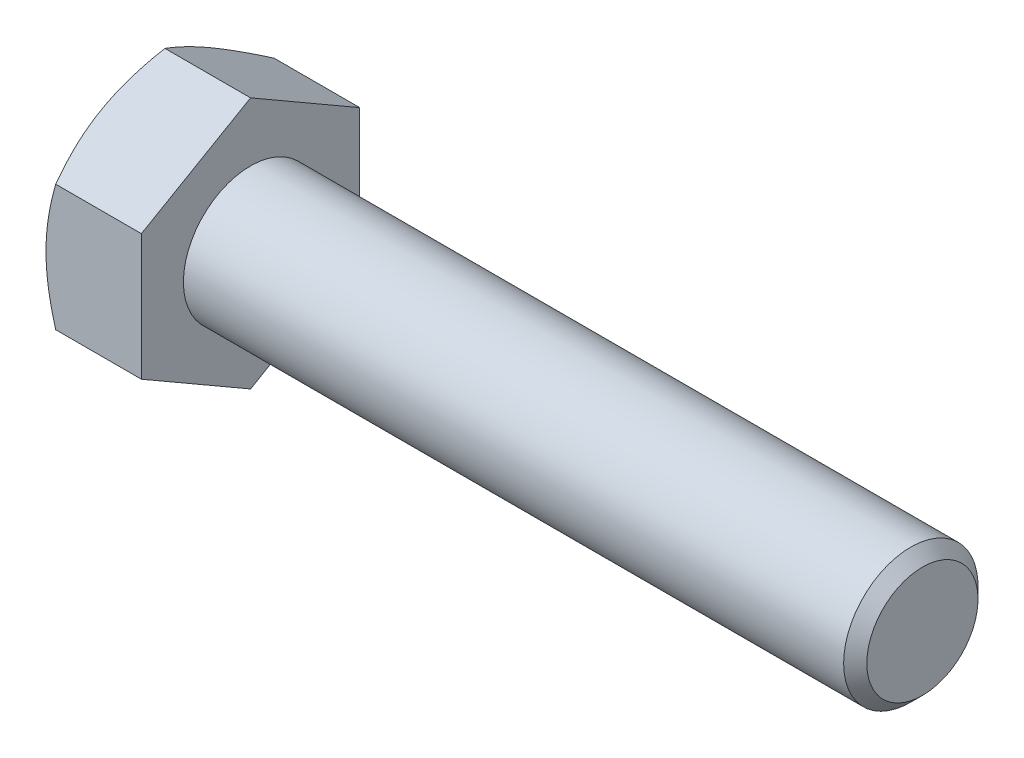
ISO-10303-21;
HEADER;
FILE_DESCRIPTION(('STEP AP214'),'2;1');
FILE_NAME('part.step','',(''),(''),'','','');
FILE_SCHEMA(('AUTOMOTIVE_DESIGN { 1 0 10303 214 1 1 1 1 }'));
ENDSEC;
DATA;
#1=APPLICATION_CONTEXT('core data for automotive mechanical design processes');
#2=APPLICATION_PROTOCOL_DEFINITION('international standard','automotive_design',2000,#1);
#3=PRODUCT_CONTEXT('',#1,'mechanical');
#4=PRODUCT('Part','Part','',(#3));
#5=PRODUCT_RELATED_PRODUCT_CATEGORY('part','',(#4));
#6=PRODUCT_DEFINITION_FORMATION('','',#4);
#7=PRODUCT_DEFINITION_CONTEXT('part definition',#1,'design');
#8=PRODUCT_DEFINITION('design','',#6,#7);
#9=PRODUCT_DEFINITION_SHAPE('','',#8);
#10=(LENGTH_UNIT() NAMED_UNIT(*) SI_UNIT(.MILLI.,.METRE.));
#11=(NAMED_UNIT(*) PLANE_ANGLE_UNIT() SI_UNIT($,.RADIAN.));
#12=(NAMED_UNIT(*) SI_UNIT($,.STERADIAN.) SOLID_ANGLE_UNIT());
#13=UNCERTAINTY_MEASURE_WITH_UNIT(LENGTH_MEASURE(1.E-05),#10,'distance_accuracy_value','');
#14=(GEOMETRIC_REPRESENTATION_CONTEXT(3) GLOBAL_UNCERTAINTY_ASSIGNED_CONTEXT((#13)) GLOBAL_UNIT_ASSIGNED_CONTEXT((#10,
#11,#12)) REPRESENTATION_CONTEXT('',''));
#15=CARTESIAN_POINT('',(0.,0.,0.));
#16=DIRECTION('',(0.,0.,1.));
#17=DIRECTION('',(1.,0.,0.));
#18=AXIS2_PLACEMENT_3D('',#15,#16,#17);
#19=CARTESIAN_POINT('',(0.,7.50555349946514,0.));
#20=DIRECTION('',(1.,0.,0.));
#21=DIRECTION('',(0.,0.,-1.));
#22=AXIS2_PLACEMENT_3D('',#19,#20,#21);
#23=PLANE('',#22);
#24=CARTESIAN_POINT('',(0.,0.,0.));
#25=DIRECTION('',(1.,0.,0.));
#26=DIRECTION('',(0.,0.,-1.));
#27=AXIS2_PLACEMENT_3D('',#24,#25,#26);
#28=CIRCLE('',#27,6.49999999995998);
#29=CARTESIAN_POINT('',(1.1554805519667E-11,-5.62916512458152,-3.24999999999));
#30=VERTEX_POINT('',#29);
#31=CARTESIAN_POINT('',(1.15517968402898E-11,0.,-6.49999999997999));
#32=VERTEX_POINT('',#31);
#33=EDGE_CURVE('E328',#30,#32,#28,.T.);
#34=ORIENTED_EDGE('',*,*,#33,.F.);
#35=CARTESIAN_POINT('',(0.,0.,0.));
#36=DIRECTION('',(1.,0.,0.));
#37=DIRECTION('',(0.,0.,-1.));
#38=AXIS2_PLACEMENT_3D('',#35,#36,#37);
#39=CIRCLE('',#38,6.49999999995998);
#40=CARTESIAN_POINT('',(1.15535315983569E-11,-5.62916512458152,3.24999999999001));
#41=VERTEX_POINT('',#40);
#42=EDGE_CURVE('E327',#41,#30,#39,.T.);
#43=ORIENTED_EDGE('',*,*,#42,.F.);
#44=CARTESIAN_POINT('',(0.,0.,0.));
#45=DIRECTION('',(1.,0.,0.));
#46=DIRECTION('',(0.,0.,-1.));
#47=AXIS2_PLACEMENT_3D('',#44,#45,#46);
#48=CIRCLE('',#47,6.49999999995998);
#49=CARTESIAN_POINT('',(1.15519155837212E-11,0.,6.49999999997999));
#50=VERTEX_POINT('',#49);
#51=EDGE_CURVE('E89',#50,#41,#48,.T.);
#52=ORIENTED_EDGE('',*,*,#51,.F.);
#53=CARTESIAN_POINT('',(0.,0.,0.));
#54=DIRECTION('',(1.,0.,0.));
#55=DIRECTION('',(0.,0.,-1.));
#56=AXIS2_PLACEMENT_3D('',#53,#54,#55);
#57=CIRCLE('',#56,6.49999999995998);
#58=CARTESIAN_POINT('',(1.15520511365155E-11,5.62916512458152,3.24999999999));
#59=VERTEX_POINT('',#58);
#60=EDGE_CURVE('E87',#59,#50,#57,.T.);
#61=ORIENTED_EDGE('',*,*,#60,.F.);
#62=CARTESIAN_POINT('',(0.,0.,0.));
#63=DIRECTION('',(1.,0.,0.));
#64=DIRECTION('',(0.,0.,-1.));
#65=AXIS2_PLACEMENT_3D('',#62,#63,#64);
#66=CIRCLE('',#65,6.49999999995998);
#67=CARTESIAN_POINT('',(1.15517697006444E-11,5.62916512458152,-3.24999999999));
#68=VERTEX_POINT('',#67);
#69=EDGE_CURVE('E20',#68,#59,#66,.T.);
#70=ORIENTED_EDGE('',*,*,#69,.F.);
#71=CARTESIAN_POINT('',(0.,0.,0.));
#72=DIRECTION('',(1.,0.,0.));
#73=DIRECTION('',(0.,0.,-1.));
#74=AXIS2_PLACEMENT_3D('',#71,#72,#73);
#75=CIRCLE('',#74,6.49999999995998);
#76=EDGE_CURVE('E255',#32,#68,#75,.T.);
#77=ORIENTED_EDGE('',*,*,#76,.F.);
#78=EDGE_LOOP('',(#34,#43,#52,#61,#70,#77));
#79=FACE_BOUND('',#78,.T.);
#80=ADVANCED_FACE('F17',(#79),#23,.F.);
#81=CARTESIAN_POINT('',(0.584039923069213,0.,0.));
#82=DIRECTION('',(1.,0.,0.));
#83=DIRECTION('',(0.,0.,-1.));
#84=AXIS2_PLACEMENT_3D('',#81,#82,#83);
#85=CONICAL_SURFACE('',#84,7.51158682032838,1.04719755118114);
#86=CARTESIAN_POINT('',(0.580556583641221,7.5055534994593,-1.01141590976194E-11));
#87=CARTESIAN_POINT('',(0.492351589125,7.35281628522806,-0.264548615265159));
#88=CARTESIAN_POINT('',(0.411540414631932,7.19885589649827,-0.5312158308982));
#89=CARTESIAN_POINT('',(0.269031363404723,6.88957797343334,-1.06690090730603));
#90=CARTESIAN_POINT('',(0.20723897557,6.73427122699106,-1.33590008290229));
#91=CARTESIAN_POINT('',(0.131368414300901,6.49984538856169,-1.74193754566888));
#92=CARTESIAN_POINT('',(0.108872020471764,6.42140731241904,-1.8777962787959));
#93=CARTESIAN_POINT('',(0.0699302938058337,6.26415564509042,-2.15016415618399));
#94=CARTESIAN_POINT('',(0.0534848017047081,6.18534206384335,-2.28667328323038));
#95=CARTESIAN_POINT('',(0.0269338255104162,6.02704786462262,-2.56084687882412));
#96=CARTESIAN_POINT('',(0.0168605830586541,5.9475658842654,-2.69851370708901));
#97=CARTESIAN_POINT('',(0.00337972763268399,5.78844560823798,-2.97411810968289));
#98=CARTESIAN_POINT('',(-2.65652346825E-05,5.7088072847349,-3.11205573221982));
#99=CARTESIAN_POINT('',(2.3103664594172E-11,5.62916512459895,-3.24999999999983));
#100=B_SPLINE_CURVE_WITH_KNOTS('',3,(#86,#87,#88,#89,#90,#91,#92,#93,#94,#95,#96,#97,#98,#99),
.UNSPECIFIED.,.F.,.F.,(4,2,2,2,2,2,4),(0.,0.954247655905905,1.90367376213541,2.37900973801043,
2.85433320178608,3.33204281625578,3.80984701130533),.UNSPECIFIED.);
#101=CARTESIAN_POINT('',(0.580556583641221,7.5055534994593,0.));
#102=VERTEX_POINT('',#101);
#103=EDGE_CURVE('E99',#102,#68,#100,.T.);
#104=ORIENTED_EDGE('',*,*,#103,.T.);
#105=ORIENTED_EDGE('',*,*,#69,.T.);
#106=CARTESIAN_POINT('',(2.38257500923756E-11,5.62916512459776,3.24999999999938));
#107=CARTESIAN_POINT('',(-2.65652344257552E-05,5.70880728473443,3.11205573221975));
#108=CARTESIAN_POINT('',(0.00337972763274897,5.7884456082378,2.97411810968296));
#109=CARTESIAN_POINT('',(0.0168605830585776,5.94756588426544,2.69851370708918));
#110=CARTESIAN_POINT('',(0.0269338255103896,6.02704786462259,2.56084687882423));
#111=CARTESIAN_POINT('',(0.0534848017047181,6.18534206384328,2.28667328323044));
#112=CARTESIAN_POINT('',(0.0699302938058302,6.26415564509038,2.15016415618406));
#113=CARTESIAN_POINT('',(0.10887202047175,6.42140731241902,1.87779627879596));
#114=CARTESIAN_POINT('',(0.131368414300891,6.49984538856167,1.74193754566893));
#115=CARTESIAN_POINT('',(0.207238975569995,6.73427122699103,1.33590008290232));
#116=CARTESIAN_POINT('',(0.269031363404717,6.88957797343332,1.06690090730607));
#117=CARTESIAN_POINT('',(0.411540414631924,7.19885589649826,0.531215830898222));
#118=CARTESIAN_POINT('',(0.492351589124994,7.35281628522806,0.264548615265173));
#119=CARTESIAN_POINT('',(0.580556583641221,7.5055534994593,1.01137987216797E-11));
#120=B_SPLINE_CURVE_WITH_KNOTS('',3,(#106,#107,#108,#109,#110,#111,#112,#113,#114,#115,#116,
#117,#118,#119),.UNSPECIFIED.,.F.,.F.,(4,2,2,2,2,2,4),(0.,0.4778041950496,0.955513809519338,
1.43083727329502,1.90617324917006,2.85559935539958,3.80984701130552),.UNSPECIFIED.);
#121=EDGE_CURVE('E97',#59,#102,#120,.T.);
#122=ORIENTED_EDGE('',*,*,#121,.T.);
#123=EDGE_LOOP('',(#104,#105,#122));
#124=FACE_BOUND('',#123,.T.);
#125=ADVANCED_FACE('F95',(#124),#85,.T.);
#126=CARTESIAN_POINT('',(0.584039923069213,0.,0.));
#127=DIRECTION('',(1.,0.,0.));
#128=DIRECTION('',(0.,0.,-1.));
#129=AXIS2_PLACEMENT_3D('',#126,#127,#128);
#130=CONICAL_SURFACE('',#129,7.51158682032838,1.04719755118114);
#131=CARTESIAN_POINT('',(0.580556583641216,3.7527767497384,6.49999999998989));
#132=CARTESIAN_POINT('',(0.492351589124996,3.90551396396964,6.23545138473484));
#133=CARTESIAN_POINT('',(0.411540414631929,4.05947435269943,5.9687841691018));
#134=CARTESIAN_POINT('',(0.269031363404721,4.36875227576436,5.43309909269397));
#135=CARTESIAN_POINT('',(0.207238975569998,4.52405902220664,5.16409991709772));
#136=CARTESIAN_POINT('',(0.1313684143009,4.75848486063601,4.75806245433112));
#137=CARTESIAN_POINT('',(0.108872020471763,4.83692293677865,4.6222037212041));
#138=CARTESIAN_POINT('',(0.0699302938058334,4.99417460410727,4.34983584381602));
#139=CARTESIAN_POINT('',(0.053484801704708,5.07298818535435,4.21332671676963));
#140=CARTESIAN_POINT('',(0.0269338255104163,5.23128238457508,3.93915312117589));
#141=CARTESIAN_POINT('',(0.0168605830586542,5.3107643649323,3.801486292911));
#142=CARTESIAN_POINT('',(0.00337972763268392,5.46988464095971,3.52588189031713));
#143=CARTESIAN_POINT('',(-2.65652346825878E-05,5.54952296446279,3.3879442677802));
#144=CARTESIAN_POINT('',(2.31038105577112E-11,5.62916512459874,3.25000000000019));
#145=B_SPLINE_CURVE_WITH_KNOTS('',3,(#131,#132,#133,#134,#135,#136,#137,#138,#139,#140,#141,
#142,#143,#144),.UNSPECIFIED.,.F.,.F.,(4,2,2,2,2,2,4),(0.,0.954247655905901,1.9036737621354,
2.37900973801042,2.85433320178607,3.33204281625577,3.80984701130531),.UNSPECIFIED.);
#146=CARTESIAN_POINT('',(0.580556583641216,3.75277674972964,6.49999999999494));
#147=VERTEX_POINT('',#146);
#148=EDGE_CURVE('E102',#147,#59,#145,.T.);
#149=ORIENTED_EDGE('',*,*,#148,.T.);
#150=ORIENTED_EDGE('',*,*,#60,.T.);
#151=CARTESIAN_POINT('',(2.38261673016344E-11,0.,6.49999999999875));
#152=CARTESIAN_POINT('',(-2.65652344259214E-05,0.159284320271937,6.49999999999955));
#153=CARTESIAN_POINT('',(0.00337972763274863,0.318560967278107,6.49999999999988));
#154=CARTESIAN_POINT('',(0.0168605830585772,0.63680151933298,6.50000000000012));
#155=CARTESIAN_POINT('',(0.0269338255103893,0.795765480047427,6.50000000000003));
#156=CARTESIAN_POINT('',(0.0534848017047176,1.11235387848891,6.49999999999997));
#157=CARTESIAN_POINT('',(0.0699302938058296,1.26998104098307,6.49999999999999));
#158=CARTESIAN_POINT('',(0.108872020471749,1.58448437564032,6.50000000000001));
#159=CARTESIAN_POINT('',(0.13136841430089,1.74136052792562,6.5));
#160=CARTESIAN_POINT('',(0.207238975569994,2.21021220478437,6.49999999999999));
#161=CARTESIAN_POINT('',(0.269031363404715,2.52082569766894,6.5));
#162=CARTESIAN_POINT('',(0.411540414631921,3.13938154379881,6.5));
#163=CARTESIAN_POINT('',(0.492351589124989,3.44730232125839,6.50000000000001));
#164=CARTESIAN_POINT('',(0.580556583641216,3.75277674972088,6.5));
#165=B_SPLINE_CURVE_WITH_KNOTS('',3,(#151,#152,#153,#154,#155,#156,#157,#158,#159,#160,#161,
#162,#163,#164),.UNSPECIFIED.,.F.,.F.,(4,2,2,2,2,2,4),(0.,0.477804195049598,0.955513809519334,
1.43083727329501,1.90617324917006,2.85559935539956,3.8098470113055),.UNSPECIFIED.);
#166=EDGE_CURVE('E105',#50,#147,#165,.T.);
#167=ORIENTED_EDGE('',*,*,#166,.T.);
#168=EDGE_LOOP('',(#149,#150,#167));
#169=FACE_BOUND('',#168,.T.);
#170=ADVANCED_FACE('F103',(#169),#130,.T.);
#171=CARTESIAN_POINT('',(0.584039923069213,0.,0.));
#172=DIRECTION('',(1.,0.,0.));
#173=DIRECTION('',(0.,0.,-1.));
#174=AXIS2_PLACEMENT_3D('',#171,#172,#173);
#175=CONICAL_SURFACE('',#174,7.51158682032838,1.04719755118114);
#176=ORIENTED_EDGE('',*,*,#51,.T.);
#177=CARTESIAN_POINT('',(2.38295455634263E-11,-5.62916512459776,3.24999999999939));
#178=CARTESIAN_POINT('',(-2.65652344231531E-05,-5.54952296446249,3.38794426777983));
#179=CARTESIAN_POINT('',(0.00337972763275132,-5.46988464095969,3.52588189031694));
#180=CARTESIAN_POINT('',(0.01686058305858,-5.31076436493246,3.80148629291096));
#181=CARTESIAN_POINT('',(0.0269338255103923,-5.23128238457516,3.93915312117582));
#182=CARTESIAN_POINT('',(0.0534848017047204,-5.07298818535436,4.21332671676954));
#183=CARTESIAN_POINT('',(0.0699302938058321,-4.9941746041073,4.34983584381595));
#184=CARTESIAN_POINT('',(0.108872020471752,-4.83692293677869,4.62220372120406));
#185=CARTESIAN_POINT('',(0.131368414300892,-4.75848486063603,4.75806245433109));
#186=CARTESIAN_POINT('',(0.207238975569996,-4.52405902220665,5.16409991709768));
#187=CARTESIAN_POINT('',(0.269031363404717,-4.36875227576437,5.43309909269394));
#188=CARTESIAN_POINT('',(0.411540414631922,-4.05947435269944,5.96878416910179));
#189=CARTESIAN_POINT('',(0.492351589124991,-3.90551396396965,6.23545138473484));
#190=CARTESIAN_POINT('',(0.580556583641217,-3.7527767497384,6.49999999998989));
#191=B_SPLINE_CURVE_WITH_KNOTS('',3,(#177,#178,#179,#180,#181,#182,#183,#184,#185,#186,#187,
#188,#189,#190),.UNSPECIFIED.,.F.,.F.,(4,2,2,2,2,2,4),(0.,0.477804195049597,0.955513809519333,
1.43083727329501,1.90617324917005,2.85559935539956,3.8098470113055),.UNSPECIFIED.);
#192=CARTESIAN_POINT('',(0.580556583641216,-3.75277674972964,6.49999999999494));
#193=VERTEX_POINT('',#192);
#194=EDGE_CURVE('E174',#41,#193,#191,.T.);
#195=ORIENTED_EDGE('',*,*,#194,.T.);
#196=CARTESIAN_POINT('',(0.580556583641215,-3.75277674972088,6.5));
#197=CARTESIAN_POINT('',(0.492351589124996,-3.4473023212584,6.5));
#198=CARTESIAN_POINT('',(0.411540414631928,-3.13938154379883,6.5));
#199=CARTESIAN_POINT('',(0.269031363404721,-2.52082569766897,6.5));
#200=CARTESIAN_POINT('',(0.207238975569998,-2.21021220478441,6.5));
#201=CARTESIAN_POINT('',(0.1313684143009,-1.74136052792568,6.5));
#202=CARTESIAN_POINT('',(0.108872020471763,-1.58448437564038,6.5));
#203=CARTESIAN_POINT('',(0.0699302938058336,-1.26998104098315,6.5));
#204=CARTESIAN_POINT('',(0.053484801704708,-1.112353878489,6.5));
#205=CARTESIAN_POINT('',(0.0269338255104159,-0.795765480047534,6.5));
#206=CARTESIAN_POINT('',(0.0168605830586538,-0.636801519333099,6.5));
#207=CARTESIAN_POINT('',(0.00337972763268367,-0.318560967278262,6.5));
#208=CARTESIAN_POINT('',(-2.65652346827132E-05,-0.159284320272115,6.5));
#209=CARTESIAN_POINT('',(2.31038311674425E-11,-2.06869057568982E-13,6.5));
#210=B_SPLINE_CURVE_WITH_KNOTS('',3,(#196,#197,#198,#199,#200,#201,#202,#203,#204,#205,#206,
#207,#208,#209),.UNSPECIFIED.,.F.,.F.,(4,2,2,2,2,2,4),(0.,0.954247655905901,1.9036737621354,
2.37900973801042,2.85433320178607,3.33204281625577,3.80984701130531),.UNSPECIFIED.);
#211=EDGE_CURVE('E148',#193,#50,#210,.T.);
#212=ORIENTED_EDGE('',*,*,#211,.T.);
#213=EDGE_LOOP('',(#176,#195,#212));
#214=FACE_BOUND('',#213,.T.);
#215=ADVANCED_FACE('F139',(#214),#175,.T.);
#216=CARTESIAN_POINT('',(0.584039923069213,0.,0.));
#217=DIRECTION('',(1.,0.,0.));
#218=DIRECTION('',(0.,0.,-1.));
#219=AXIS2_PLACEMENT_3D('',#216,#217,#218);
#220=CONICAL_SURFACE('',#219,7.51158682032838,1.04719755118114);
#221=ORIENTED_EDGE('',*,*,#42,.T.);
#222=CARTESIAN_POINT('',(2.38332878672563E-11,-5.62916512459777,-3.24999999999938));
#223=CARTESIAN_POINT('',(-2.65652344192916E-05,-5.70880728473444,-3.11205573221975));
#224=CARTESIAN_POINT('',(0.00337972763275479,-5.78844560823781,-2.97411810968297));
#225=CARTESIAN_POINT('',(0.0168605830585827,-5.94756588426545,-2.69851370708918));
#226=CARTESIAN_POINT('',(0.0269338255103947,-6.0270478646226,-2.56084687882423));
#227=CARTESIAN_POINT('',(0.0534848017047234,-6.18534206384329,-2.28667328323044));
#228=CARTESIAN_POINT('',(0.0699302938058359,-6.26415564509039,-2.15016415618406));
#229=CARTESIAN_POINT('',(0.108872020471756,-6.42140731241903,-1.87779627879596));
#230=CARTESIAN_POINT('',(0.131368414300897,-6.49984538856168,-1.74193754566893));
#231=CARTESIAN_POINT('',(0.207238975570001,-6.73427122699104,-1.33590008290232));
#232=CARTESIAN_POINT('',(0.269031363404723,-6.88957797343333,-1.06690090730607));
#233=CARTESIAN_POINT('',(0.41154041463193,-7.19885589649827,-0.531215830898222));
#234=CARTESIAN_POINT('',(0.492351589124999,-7.35281628522807,-0.264548615265172));
#235=CARTESIAN_POINT('',(0.580556583641226,-7.50555349945931,-1.01131565697817E-11));
#236=B_SPLINE_CURVE_WITH_KNOTS('',3,(#222,#223,#224,#225,#226,#227,#228,#229,#230,#231,#232,
#233,#234,#235),.UNSPECIFIED.,.F.,.F.,(4,2,2,2,2,2,4),(0.,0.4778041950496,0.955513809519339,
1.43083727329502,1.90617324917007,2.85559935539958,3.80984701130552),.UNSPECIFIED.);
#237=CARTESIAN_POINT('',(0.580556583641226,-7.50555349945931,0.));
#238=VERTEX_POINT('',#237);
#239=EDGE_CURVE('E302',#30,#238,#236,.T.);
#240=ORIENTED_EDGE('',*,*,#239,.T.);
#241=CARTESIAN_POINT('',(0.580556583641226,-7.50555349945931,1.01141641692782E-11));
#242=CARTESIAN_POINT('',(0.492351589125006,-7.35281628522806,0.26454861526516));
#243=CARTESIAN_POINT('',(0.411540414631937,-7.19885589649828,0.531215830898202));
#244=CARTESIAN_POINT('',(0.269031363404727,-6.88957797343335,1.06690090730604));
#245=CARTESIAN_POINT('',(0.207238975570003,-6.73427122699106,1.33590008290229));
#246=CARTESIAN_POINT('',(0.131368414300904,-6.49984538856169,1.74193754566889));
#247=CARTESIAN_POINT('',(0.108872020471766,-6.42140731241905,1.87779627879591));
#248=CARTESIAN_POINT('',(0.0699302938058365,-6.26415564509043,2.150164156184));
#249=CARTESIAN_POINT('',(0.0534848017047109,-6.18534206384335,2.28667328323039));
#250=CARTESIAN_POINT('',(0.026933825510419,-6.02704786462262,2.56084687882413));
#251=CARTESIAN_POINT('',(0.016860583058657,-5.9475658842654,2.69851370708902));
#252=CARTESIAN_POINT('',(0.00337972763268689,-5.78844560823798,2.9741181096829));
#253=CARTESIAN_POINT('',(-2.65652346796749E-05,-5.7088072847349,3.11205573221983));
#254=CARTESIAN_POINT('',(2.3106270709861E-11,-5.62916512459895,3.24999999999984));
#255=B_SPLINE_CURVE_WITH_KNOTS('',3,(#241,#242,#243,#244,#245,#246,#247,#248,#249,#250,#251,
#252,#253,#254),.UNSPECIFIED.,.F.,.F.,(4,2,2,2,2,2,4),(0.,0.954247655905909,1.90367376213542,
2.37900973801044,2.8543332017861,3.33204281625579,3.80984701130534),.UNSPECIFIED.);
#256=EDGE_CURVE('E169',#238,#41,#255,.T.);
#257=ORIENTED_EDGE('',*,*,#256,.T.);
#258=EDGE_LOOP('',(#221,#240,#257));
#259=FACE_BOUND('',#258,.T.);
#260=ADVANCED_FACE('F318',(#259),#220,.T.);
#261=CARTESIAN_POINT('',(0.584039923069213,0.,0.));
#262=DIRECTION('',(1.,0.,0.));
#263=DIRECTION('',(0.,0.,-1.));
#264=AXIS2_PLACEMENT_3D('',#261,#262,#263);
#265=CONICAL_SURFACE('',#264,7.51158682032838,1.04719755118114);
#266=ORIENTED_EDGE('',*,*,#33,.T.);
#267=CARTESIAN_POINT('',(2.38257762244022E-11,0.,-6.49999999999875));
#268=CARTESIAN_POINT('',(-2.65652344264496E-05,-0.159284320271938,-6.49999999999955));
#269=CARTESIAN_POINT('',(0.00337972763274824,-0.318560967278108,-6.49999999999988));
#270=CARTESIAN_POINT('',(0.0168605830585772,-0.636801519332982,-6.50000000000012));
#271=CARTESIAN_POINT('',(0.0269338255103896,-0.79576548004743,-6.50000000000003));
#272=CARTESIAN_POINT('',(0.053484801704718,-1.11235387848891,-6.49999999999997));
#273=CARTESIAN_POINT('',(0.0699302938058299,-1.26998104098307,-6.49999999999999));
#274=CARTESIAN_POINT('',(0.10887202047175,-1.58448437564033,-6.50000000000001));
#275=CARTESIAN_POINT('',(0.131368414300891,-1.74136052792563,-6.5));
#276=CARTESIAN_POINT('',(0.207238975569996,-2.21021220478437,-6.49999999999999));
#277=CARTESIAN_POINT('',(0.269031363404717,-2.52082569766895,-6.5));
#278=CARTESIAN_POINT('',(0.411540414631923,-3.13938154379882,-6.5));
#279=CARTESIAN_POINT('',(0.492351589124993,-3.4473023212584,-6.50000000000001));
#280=CARTESIAN_POINT('',(0.58055658364122,-3.7527767497209,-6.5));
#281=B_SPLINE_CURVE_WITH_KNOTS('',3,(#267,#268,#269,#270,#271,#272,#273,#274,#275,#276,#277,
#278,#279,#280),.UNSPECIFIED.,.F.,.F.,(4,2,2,2,2,2,4),(0.,0.477804195049599,0.955513809519338,
1.43083727329502,1.90617324917006,2.85559935539958,3.80984701130552),.UNSPECIFIED.);
#282=CARTESIAN_POINT('',(0.58055658364122,-3.75277674972966,-6.49999999999494));
#283=VERTEX_POINT('',#282);
#284=EDGE_CURVE('E233',#32,#283,#281,.T.);
#285=ORIENTED_EDGE('',*,*,#284,.T.);
#286=CARTESIAN_POINT('',(0.58055658364122,-3.75277674973841,-6.49999999998988));
#287=CARTESIAN_POINT('',(0.492351589125001,-3.90551396396966,-6.23545138473484));
#288=CARTESIAN_POINT('',(0.411540414631933,-4.05947435269944,-5.9687841691018));
#289=CARTESIAN_POINT('',(0.269031363404726,-4.36875227576437,-5.43309909269397));
#290=CARTESIAN_POINT('',(0.207238975570004,-4.52405902220665,-5.16409991709772));
#291=CARTESIAN_POINT('',(0.131368414300906,-4.75848486063602,-4.75806245433113));
#292=CARTESIAN_POINT('',(0.108872020471769,-4.83692293677866,-4.62220372120411));
#293=CARTESIAN_POINT('',(0.069930293805839,-4.99417460410728,-4.34983584381602));
#294=CARTESIAN_POINT('',(0.0534848017047135,-5.07298818535436,-4.21332671676963));
#295=CARTESIAN_POINT('',(0.0269338255104218,-5.23128238457509,-3.93915312117589));
#296=CARTESIAN_POINT('',(0.0168605830586599,-5.31076436493231,-3.801486292911));
#297=CARTESIAN_POINT('',(0.00337972763268996,-5.46988464095972,-3.52588189031713));
#298=CARTESIAN_POINT('',(-2.65652346764806E-05,-5.5495229644628,-3.3879442677802));
#299=CARTESIAN_POINT('',(2.3109611039334E-11,-5.62916512459875,-3.25000000000019));
#300=B_SPLINE_CURVE_WITH_KNOTS('',3,(#286,#287,#288,#289,#290,#291,#292,#293,#294,#295,#296,
#297,#298,#299),.UNSPECIFIED.,.F.,.F.,(4,2,2,2,2,2,4),(0.,0.9542476559059,1.9036737621354,
2.37900973801041,2.85433320178607,3.33204281625576,3.8098470113053),.UNSPECIFIED.);
#301=EDGE_CURVE('E301',#283,#30,#300,.T.);
#302=ORIENTED_EDGE('',*,*,#301,.T.);
#303=EDGE_LOOP('',(#266,#285,#302));
#304=FACE_BOUND('',#303,.T.);
#305=ADVANCED_FACE('F247',(#304),#265,.T.);
#306=CARTESIAN_POINT('',(0.584039923069213,0.,0.));
#307=DIRECTION('',(1.,0.,0.));
#308=DIRECTION('',(0.,0.,-1.));
#309=AXIS2_PLACEMENT_3D('',#306,#307,#308);
#310=CONICAL_SURFACE('',#309,7.51158682032838,1.04719755118114);
#311=CARTESIAN_POINT('',(0.580556583641216,3.75277674972088,-6.5));
#312=CARTESIAN_POINT('',(0.492351589124997,3.4473023212584,-6.5));
#313=CARTESIAN_POINT('',(0.411540414631929,3.13938154379883,-6.5));
#314=CARTESIAN_POINT('',(0.26903136340472,2.52082569766897,-6.5));
#315=CARTESIAN_POINT('',(0.207238975569997,2.21021220478441,-6.5));
#316=CARTESIAN_POINT('',(0.1313684143009,1.74136052792568,-6.5));
#317=CARTESIAN_POINT('',(0.108872020471763,1.58448437564038,-6.5));
#318=CARTESIAN_POINT('',(0.0699302938058331,1.26998104098315,-6.5));
#319=CARTESIAN_POINT('',(0.053484801704707,1.112353878489,-6.5));
#320=CARTESIAN_POINT('',(0.0269338255104152,0.795765480047534,-6.5));
#321=CARTESIAN_POINT('',(0.0168605830586537,0.636801519333099,-6.5));
#322=CARTESIAN_POINT('',(0.00337972763268431,0.318560967278262,-6.5));
#323=CARTESIAN_POINT('',(-2.6565234681925E-05,0.159284320272115,-6.5));
#324=CARTESIAN_POINT('',(2.31037188734629E-11,2.07004600486995E-13,-6.5));
#325=B_SPLINE_CURVE_WITH_KNOTS('',3,(#311,#312,#313,#314,#315,#316,#317,#318,#319,#320,#321,
#322,#323,#324),.UNSPECIFIED.,.F.,.F.,(4,2,2,2,2,2,4),(0.,0.954247655905902,1.9036737621354,
2.37900973801042,2.85433320178607,3.33204281625577,3.80984701130531),.UNSPECIFIED.);
#326=CARTESIAN_POINT('',(0.580556583642901,3.75277674973548,-6.49999999999494));
#327=VERTEX_POINT('',#326);
#328=EDGE_CURVE('E225',#327,#32,#325,.T.);
#329=ORIENTED_EDGE('',*,*,#328,.T.);
#330=ORIENTED_EDGE('',*,*,#76,.T.);
#331=CARTESIAN_POINT('',(2.38257762244022E-11,5.62916512459776,-3.24999999999938));
#332=CARTESIAN_POINT('',(-2.65652344257157E-05,5.54952296446249,-3.38794426777982));
#333=CARTESIAN_POINT('',(0.0033797276327489,5.46988464095969,-3.52588189031693));
#334=CARTESIAN_POINT('',(0.0168605830585772,5.31076436493246,-3.80148629291095));
#335=CARTESIAN_POINT('',(0.0269338255103891,5.23128238457516,-3.93915312117581));
#336=CARTESIAN_POINT('',(0.0534848017047172,5.07298818535436,-4.21332671676953));
#337=CARTESIAN_POINT('',(0.0699302938058294,4.9941746041073,-4.34983584381594));
#338=CARTESIAN_POINT('',(0.108872020471749,4.83692293677869,-4.62220372120405));
#339=CARTESIAN_POINT('',(0.13136841430089,4.75848486063604,-4.75806245433108));
#340=CARTESIAN_POINT('',(0.207238975569994,4.52405902220666,-5.16409991709768));
#341=CARTESIAN_POINT('',(0.269031363404715,4.36875227576437,-5.43309909269394));
#342=CARTESIAN_POINT('',(0.411540414631921,4.05947435269944,-5.96878416910178));
#343=CARTESIAN_POINT('',(0.49235158912499,3.90551396396965,-6.23545138473483));
#344=CARTESIAN_POINT('',(0.580556583641216,3.7527767497384,-6.49999999998989));
#345=B_SPLINE_CURVE_WITH_KNOTS('',3,(#331,#332,#333,#334,#335,#336,#337,#338,#339,#340,#341,
#342,#343,#344),.UNSPECIFIED.,.F.,.F.,(4,2,2,2,2,2,4),(0.,0.477804195049598,0.955513809519334,
1.43083727329501,1.90617324917006,2.85559935539957,3.8098470113055),.UNSPECIFIED.);
#346=EDGE_CURVE('E115',#68,#327,#345,.T.);
#347=ORIENTED_EDGE('',*,*,#346,.T.);
#348=EDGE_LOOP('',(#329,#330,#347));
#349=FACE_BOUND('',#348,.T.);
#350=ADVANCED_FACE('F242',(#349),#310,.T.);
#351=CARTESIAN_POINT('',(45.68,0.,0.));
#352=DIRECTION('',(-1.,0.,0.));
#353=DIRECTION('',(0.,0.,1.));
#354=AXIS2_PLACEMENT_3D('',#351,#352,#353);
#355=PLANE('',#354);
#356=CARTESIAN_POINT('',(45.6799999999475,0.,0.));
#357=DIRECTION('',(-1.,0.,0.));
#358=DIRECTION('',(0.,0.,1.));
#359=AXIS2_PLACEMENT_3D('',#356,#357,#358);
#360=CIRCLE('',#359,3.30950000005714);
#361=CARTESIAN_POINT('',(45.6799999999475,0.,3.30950000005714));
#362=VERTEX_POINT('',#361);
#363=EDGE_CURVE('E196',#362,#362,#360,.T.);
#364=ORIENTED_EDGE('',*,*,#363,.F.);
#365=EDGE_LOOP('',(#364));
#366=FACE_BOUND('',#365,.T.);
#367=ADVANCED_FACE('F246',(#366),#355,.F.);
#368=CARTESIAN_POINT('',(5.68,3.75277674973256,-6.5));
#369=DIRECTION('',(0.,-0.866025403784438,0.500000000000001));
#370=DIRECTION('',(0.,-0.500000000000001,-0.866025403784438));
#371=AXIS2_PLACEMENT_3D('',#368,#369,#370);
#372=PLANE('',#371);
#373=DIRECTION('',(1.,0.,0.));
#374=VECTOR('',#373,1.);
#375=CARTESIAN_POINT('',(5.68,7.50555349946514,0.));
#376=LINE('',#375,#374);
#377=CARTESIAN_POINT('',(5.68,7.50555349946514,0.));
#378=VERTEX_POINT('',#377);
#379=EDGE_CURVE('E108',#102,#378,#376,.T.);
#380=ORIENTED_EDGE('',*,*,#379,.T.);
#381=DIRECTION('',(0.,0.500000000000001,0.866025403784438));
#382=VECTOR('',#381,1.);
#383=CARTESIAN_POINT('',(5.68,3.75277674973256,-6.5));
#384=LINE('',#383,#382);
#385=CARTESIAN_POINT('',(5.68,3.75277674973256,-6.5));
#386=VERTEX_POINT('',#385);
#387=EDGE_CURVE('E192',#386,#378,#384,.T.);
#388=ORIENTED_EDGE('',*,*,#387,.F.);
#389=DIRECTION('',(1.,0.,0.));
#390=VECTOR('',#389,1.);
#391=CARTESIAN_POINT('',(5.68,3.75277674973256,-6.5));
#392=LINE('',#391,#390);
#393=EDGE_CURVE('E232',#386,#327,#392,.F.);
#394=ORIENTED_EDGE('',*,*,#393,.T.);
#395=ORIENTED_EDGE('',*,*,#346,.F.);
#396=ORIENTED_EDGE('',*,*,#103,.F.);
#397=EDGE_LOOP('',(#380,#388,#394,#395,#396));
#398=FACE_BOUND('',#397,.T.);
#399=ADVANCED_FACE('F257',(#398),#372,.F.);
#400=CARTESIAN_POINT('',(5.68,7.50555349946514,0.));
#401=DIRECTION('',(0.,-0.866025403784438,-0.500000000000001));
#402=DIRECTION('',(0.,0.500000000000001,-0.866025403784438));
#403=AXIS2_PLACEMENT_3D('',#400,#401,#402);
#404=PLANE('',#403);
#405=DIRECTION('',(1.,0.,0.));
#406=VECTOR('',#405,1.);
#407=CARTESIAN_POINT('',(5.68,3.75277674973256,6.5));
#408=LINE('',#407,#406);
#409=CARTESIAN_POINT('',(5.68,3.75277674973256,6.5));
#410=VERTEX_POINT('',#409);
#411=EDGE_CURVE('E147',#147,#410,#408,.T.);
#412=ORIENTED_EDGE('',*,*,#411,.T.);
#413=DIRECTION('',(0.,-0.500000000000001,0.866025403784438));
#414=VECTOR('',#413,1.);
#415=CARTESIAN_POINT('',(5.68,7.50555349946514,0.));
#416=LINE('',#415,#414);
#417=EDGE_CURVE('E195',#378,#410,#416,.T.);
#418=ORIENTED_EDGE('',*,*,#417,.F.);
#419=ORIENTED_EDGE('',*,*,#379,.F.);
#420=ORIENTED_EDGE('',*,*,#121,.F.);
#421=ORIENTED_EDGE('',*,*,#148,.F.);
#422=EDGE_LOOP('',(#412,#418,#419,#420,#421));
#423=FACE_BOUND('',#422,.T.);
#424=ADVANCED_FACE('F111',(#423),#404,.F.);
#425=CARTESIAN_POINT('',(5.68,3.75277674973256,6.5));
#426=DIRECTION('',(0.,0.,-1.));
#427=DIRECTION('',(0.,1.,0.));
#428=AXIS2_PLACEMENT_3D('',#425,#426,#427);
#429=PLANE('',#428);
#430=DIRECTION('',(1.,0.,0.));
#431=VECTOR('',#430,1.);
#432=CARTESIAN_POINT('',(5.68,-3.75277674973256,6.5));
#433=LINE('',#432,#431);
#434=CARTESIAN_POINT('',(5.68,-3.75277674973256,6.5));
#435=VERTEX_POINT('',#434);
#436=EDGE_CURVE('E178',#193,#435,#433,.T.);
#437=ORIENTED_EDGE('',*,*,#436,.T.);
#438=DIRECTION('',(0.,1.,0.));
#439=VECTOR('',#438,1.);
#440=CARTESIAN_POINT('',(5.68,7.50555349946514,6.5));
#441=LINE('',#440,#439);
#442=EDGE_CURVE('E212',#410,#435,#441,.F.);
#443=ORIENTED_EDGE('',*,*,#442,.F.);
#444=ORIENTED_EDGE('',*,*,#411,.F.);
#445=ORIENTED_EDGE('',*,*,#166,.F.);
#446=ORIENTED_EDGE('',*,*,#211,.F.);
#447=EDGE_LOOP('',(#437,#443,#444,#445,#446));
#448=FACE_BOUND('',#447,.T.);
#449=ADVANCED_FACE('F153',(#448),#429,.F.);
#450=CARTESIAN_POINT('',(5.68,-7.50555349946515,0.));
#451=DIRECTION('',(0.,0.866025403784438,-0.500000000000002));
#452=DIRECTION('',(0.,0.500000000000002,0.866025403784438));
#453=AXIS2_PLACEMENT_3D('',#450,#451,#452);
#454=PLANE('',#453);
#455=DIRECTION('',(1.,0.,0.));
#456=VECTOR('',#455,1.);
#457=CARTESIAN_POINT('',(5.68,-7.50555349946515,0.));
#458=LINE('',#457,#456);
#459=CARTESIAN_POINT('',(5.68,-7.50555349946515,0.));
#460=VERTEX_POINT('',#459);
#461=EDGE_CURVE('E299',#238,#460,#458,.T.);
#462=ORIENTED_EDGE('',*,*,#461,.T.);
#463=DIRECTION('',(0.,-0.500000000000002,-0.866025403784437));
#464=VECTOR('',#463,1.);
#465=CARTESIAN_POINT('',(5.68,-3.75277674973256,6.5));
#466=LINE('',#465,#464);
#467=EDGE_CURVE('E207',#435,#460,#466,.T.);
#468=ORIENTED_EDGE('',*,*,#467,.F.);
#469=ORIENTED_EDGE('',*,*,#436,.F.);
#470=ORIENTED_EDGE('',*,*,#194,.F.);
#471=ORIENTED_EDGE('',*,*,#256,.F.);
#472=EDGE_LOOP('',(#462,#468,#469,#470,#471));
#473=FACE_BOUND('',#472,.T.);
#474=ADVANCED_FACE('F157',(#473),#454,.F.);
#475=CARTESIAN_POINT('',(5.68,-3.75277674973258,-6.5));
#476=DIRECTION('',(0.,0.866025403784438,0.500000000000001));
#477=DIRECTION('',(0.,-0.500000000000001,0.866025403784438));
#478=AXIS2_PLACEMENT_3D('',#475,#476,#477);
#479=PLANE('',#478);
#480=DIRECTION('',(1.,0.,0.));
#481=VECTOR('',#480,1.);
#482=CARTESIAN_POINT('',(5.68,-3.75277674973258,-6.5));
#483=LINE('',#482,#481);
#484=CARTESIAN_POINT('',(5.68,-3.75277674973258,-6.5));
#485=VERTEX_POINT('',#484);
#486=EDGE_CURVE('E35',#283,#485,#483,.T.);
#487=ORIENTED_EDGE('',*,*,#486,.T.);
#488=DIRECTION('',(0.,0.500000000000001,-0.866025403784438));
#489=VECTOR('',#488,1.);
#490=CARTESIAN_POINT('',(5.68,-7.50555349946515,0.));
#491=LINE('',#490,#489);
#492=EDGE_CURVE('E202',#460,#485,#491,.T.);
#493=ORIENTED_EDGE('',*,*,#492,.F.);
#494=ORIENTED_EDGE('',*,*,#461,.F.);
#495=ORIENTED_EDGE('',*,*,#239,.F.);
#496=ORIENTED_EDGE('',*,*,#301,.F.);
#497=EDGE_LOOP('',(#487,#493,#494,#495,#496));
#498=FACE_BOUND('',#497,.T.);
#499=ADVANCED_FACE('F163',(#498),#479,.F.);
#500=CARTESIAN_POINT('',(5.68,3.75277674973256,-6.5));
#501=DIRECTION('',(0.,0.,1.));
#502=DIRECTION('',(1.,0.,0.));
#503=AXIS2_PLACEMENT_3D('',#500,#501,#502);
#504=PLANE('',#503);
#505=ORIENTED_EDGE('',*,*,#393,.F.);
#506=DIRECTION('',(0.,1.,0.));
#507=VECTOR('',#506,1.);
#508=CARTESIAN_POINT('',(5.68,7.50555349946514,-6.5));
#509=LINE('',#508,#507);
#510=EDGE_CURVE('E199',#485,#386,#509,.T.);
#511=ORIENTED_EDGE('',*,*,#510,.F.);
#512=ORIENTED_EDGE('',*,*,#486,.F.);
#513=ORIENTED_EDGE('',*,*,#284,.F.);
#514=ORIENTED_EDGE('',*,*,#328,.F.);
#515=EDGE_LOOP('',(#505,#511,#512,#513,#514));
#516=FACE_BOUND('',#515,.T.);
#517=ADVANCED_FACE('F239',(#516),#504,.F.);
#518=CARTESIAN_POINT('',(44.9895000000424,0.,0.));
#519=DIRECTION('',(-1.,0.,0.));
#520=DIRECTION('',(0.,0.,1.));
#521=AXIS2_PLACEMENT_3D('',#518,#519,#520);
#522=CONICAL_SURFACE('',#521,3.99999999990541,0.785398163356287);
#523=CARTESIAN_POINT('',(44.9895,0.,0.));
#524=DIRECTION('',(-1.,0.,0.));
#525=DIRECTION('',(0.,0.,1.));
#526=AXIS2_PLACEMENT_3D('',#523,#524,#525);
#527=CIRCLE('',#526,4.);
#528=CARTESIAN_POINT('',(44.9895,0.,4.));
#529=VERTEX_POINT('',#528);
#530=EDGE_CURVE('E26',#529,#529,#527,.T.);
#531=ORIENTED_EDGE('',*,*,#530,.F.);
#532=EDGE_LOOP('',(#531));
#533=FACE_BOUND('',#532,.T.);
#534=ORIENTED_EDGE('',*,*,#363,.T.);
#535=EDGE_LOOP('',(#534));
#536=FACE_BOUND('',#535,.T.);
#537=ADVANCED_FACE('F276',(#533,#536),#522,.T.);
#538=CARTESIAN_POINT('',(5.68,7.50555349946514,0.));
#539=DIRECTION('',(1.,0.,0.));
#540=DIRECTION('',(0.,0.,-1.));
#541=AXIS2_PLACEMENT_3D('',#538,#539,#540);
#542=PLANE('',#541);
#543=CARTESIAN_POINT('',(5.68,0.,0.));
#544=DIRECTION('',(-1.,0.,0.));
#545=DIRECTION('',(0.,0.,1.));
#546=AXIS2_PLACEMENT_3D('',#543,#544,#545);
#547=CIRCLE('',#546,4.);
#548=CARTESIAN_POINT('',(5.68,0.,4.));
#549=VERTEX_POINT('',#548);
#550=EDGE_CURVE('E11',#549,#549,#547,.F.);
#551=ORIENTED_EDGE('',*,*,#550,.F.);
#552=EDGE_LOOP('',(#551));
#553=FACE_BOUND('',#552,.T.);
#554=ORIENTED_EDGE('',*,*,#492,.T.);
#555=ORIENTED_EDGE('',*,*,#510,.T.);
#556=ORIENTED_EDGE('',*,*,#387,.T.);
#557=ORIENTED_EDGE('',*,*,#417,.T.);
#558=ORIENTED_EDGE('',*,*,#442,.T.);
#559=ORIENTED_EDGE('',*,*,#467,.T.);
#560=EDGE_LOOP('',(#554,#555,#556,#557,#558,#559));
#561=FACE_BOUND('',#560,.T.);
#562=ADVANCED_FACE('F270',(#553,#561),#542,.T.);
#563=CARTESIAN_POINT('',(0.,0.,0.));
#564=DIRECTION('',(-1.,0.,0.));
#565=DIRECTION('',(0.,0.,1.));
#566=AXIS2_PLACEMENT_3D('',#563,#564,#565);
#567=CYLINDRICAL_SURFACE('',#566,4.);
#568=ORIENTED_EDGE('',*,*,#550,.T.);
#569=EDGE_LOOP('',(#568));
#570=FACE_BOUND('',#569,.T.);
#571=ORIENTED_EDGE('',*,*,#530,.T.);
#572=EDGE_LOOP('',(#571));
#573=FACE_BOUND('',#572,.T.);
#574=ADVANCED_FACE('F268',(#570,#573),#567,.T.);
#575=CLOSED_SHELL('',(#80,#125,#170,#215,#260,#305,#350,#367,#399,#424,#449,#474,#499,#517,#537,
#562,#574));
#576=MANIFOLD_SOLID_BREP('B1',#575);
#577=ADVANCED_BREP_SHAPE_REPRESENTATION('',(#18,#576),#14);
#578=SHAPE_DEFINITION_REPRESENTATION(#9,#577);
ENDSEC;
END-ISO-10303-21;
